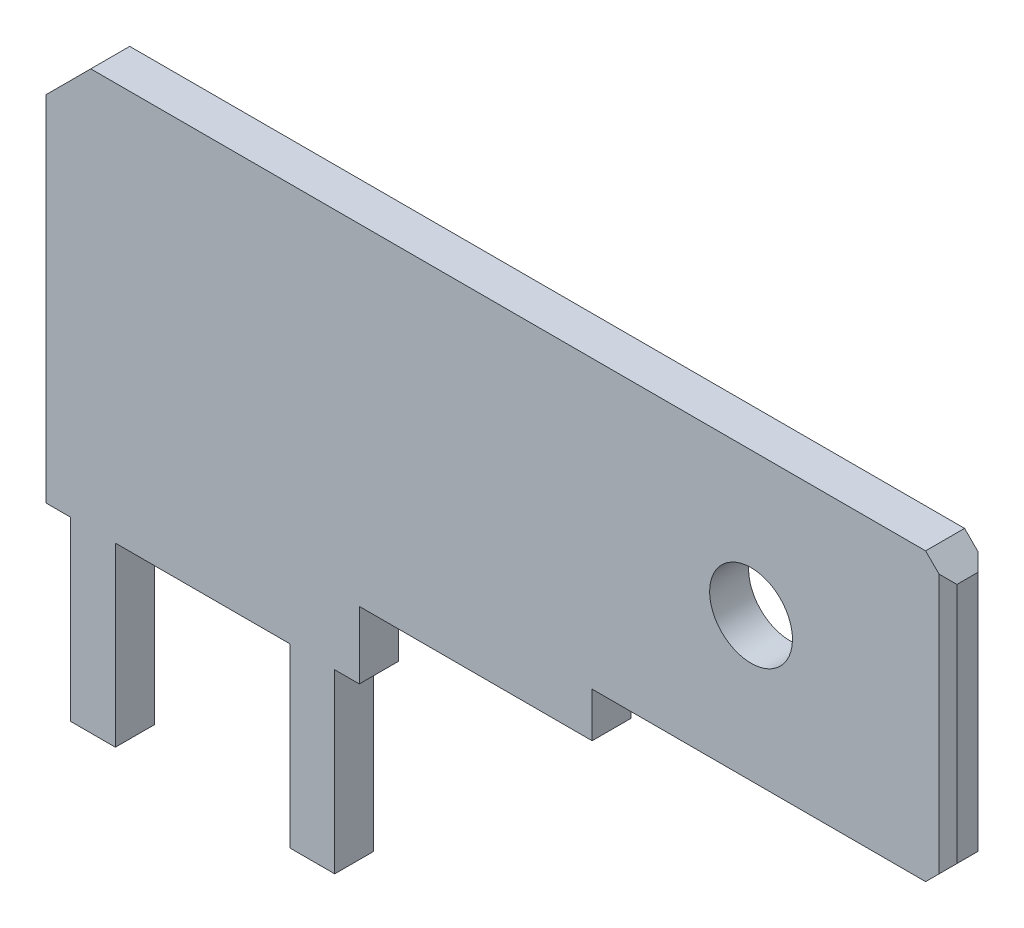
ISO-10303-21;
HEADER;
FILE_DESCRIPTION(('STEP AP214'),'2;1');
FILE_NAME('part.step','',(''),(''),'','','');
FILE_SCHEMA(('AUTOMOTIVE_DESIGN { 1 0 10303 214 1 1 1 1 }'));
ENDSEC;
DATA;
#1=APPLICATION_CONTEXT('core data for automotive mechanical design processes');
#2=APPLICATION_PROTOCOL_DEFINITION('international standard','automotive_design',2000,#1);
#3=PRODUCT_CONTEXT('',#1,'mechanical');
#4=PRODUCT('Part','Part','',(#3));
#5=PRODUCT_RELATED_PRODUCT_CATEGORY('part','',(#4));
#6=PRODUCT_DEFINITION_FORMATION('','',#4);
#7=PRODUCT_DEFINITION_CONTEXT('part definition',#1,'design');
#8=PRODUCT_DEFINITION('design','',#6,#7);
#9=PRODUCT_DEFINITION_SHAPE('','',#8);
#10=(LENGTH_UNIT() NAMED_UNIT(*) SI_UNIT(.MILLI.,.METRE.));
#11=(NAMED_UNIT(*) PLANE_ANGLE_UNIT() SI_UNIT($,.RADIAN.));
#12=(NAMED_UNIT(*) SI_UNIT($,.STERADIAN.) SOLID_ANGLE_UNIT());
#13=UNCERTAINTY_MEASURE_WITH_UNIT(LENGTH_MEASURE(1.E-05),#10,'distance_accuracy_value','');
#14=(GEOMETRIC_REPRESENTATION_CONTEXT(3) GLOBAL_UNCERTAINTY_ASSIGNED_CONTEXT((#13)) GLOBAL_UNIT_ASSIGNED_CONTEXT((#10,
#11,#12)) REPRESENTATION_CONTEXT('',''));
#15=CARTESIAN_POINT('',(0.,0.,0.));
#16=DIRECTION('',(0.,0.,1.));
#17=DIRECTION('',(1.,0.,0.));
#18=AXIS2_PLACEMENT_3D('',#15,#16,#17);
#19=CARTESIAN_POINT('',(20.05,-2.77804465493911,0.1));
#20=DIRECTION('',(0.707106781186547,0.,-0.707106781186548));
#21=DIRECTION('',(-0.707106781186548,0.,-0.707106781186547));
#22=AXIS2_PLACEMENT_3D('',#19,#20,#21);
#23=PLANE('',#22);
#24=DIRECTION('',(-0.577350269189627,-0.577350269189627,-0.577350269189623));
#25=VECTOR('',#24,1.);
#26=CARTESIAN_POINT('',(20.15,-5.9,0.200000000000002));
#27=LINE('',#26,#25);
#28=CARTESIAN_POINT('',(20.15,-5.9,0.200000000000001));
#29=VERTEX_POINT('',#28);
#30=CARTESIAN_POINT('',(19.95,-6.1,0.));
#31=VERTEX_POINT('',#30);
#32=EDGE_CURVE('E169',#29,#31,#27,.T.);
#33=ORIENTED_EDGE('',*,*,#32,.T.);
#34=DIRECTION('',(0.,1.,0.));
#35=VECTOR('',#34,1.);
#36=CARTESIAN_POINT('',(19.95,-5.55608930987822,0.));
#37=LINE('',#36,#35);
#38=CARTESIAN_POINT('',(19.95,-0.3,0.));
#39=VERTEX_POINT('',#38);
#40=EDGE_CURVE('E167',#31,#39,#37,.T.);
#41=ORIENTED_EDGE('',*,*,#40,.T.);
#42=DIRECTION('',(0.577350269189629,-0.577350269189625,0.577350269189624));
#43=VECTOR('',#42,1.);
#44=CARTESIAN_POINT('',(19.95,-0.299999999999999,0.));
#45=LINE('',#44,#43);
#46=CARTESIAN_POINT('',(20.15,-0.5,0.200000000000001));
#47=VERTEX_POINT('',#46);
#48=EDGE_CURVE('E161',#39,#47,#45,.T.);
#49=ORIENTED_EDGE('',*,*,#48,.T.);
#50=DIRECTION('',(0.,1.,0.));
#51=VECTOR('',#50,1.);
#52=CARTESIAN_POINT('',(20.15,0.,0.2));
#53=LINE('',#52,#51);
#54=EDGE_CURVE('E164',#29,#47,#53,.T.);
#55=ORIENTED_EDGE('',*,*,#54,.F.);
#56=EDGE_LOOP('',(#33,#41,#49,#55));
#57=FACE_BOUND('',#56,.T.);
#58=ADVANCED_FACE('F16',(#57),#23,.T.);
#59=CARTESIAN_POINT('',(20.15,0.,0.));
#60=DIRECTION('',(1.,0.,0.));
#61=DIRECTION('',(0.,0.,-1.));
#62=AXIS2_PLACEMENT_3D('',#59,#60,#61);
#63=PLANE('',#62);
#64=DIRECTION('',(0.,1.,0.));
#65=VECTOR('',#64,1.);
#66=CARTESIAN_POINT('',(20.15,-2.77804465493911,0.669999999999998));
#67=LINE('',#66,#65);
#68=CARTESIAN_POINT('',(20.15,-5.9,0.67));
#69=VERTEX_POINT('',#68);
#70=CARTESIAN_POINT('',(20.15,-0.5,0.67));
#71=VERTEX_POINT('',#70);
#72=EDGE_CURVE('E266',#69,#71,#67,.T.);
#73=ORIENTED_EDGE('',*,*,#72,.F.);
#74=DIRECTION('',(0.,0.,1.));
#75=VECTOR('',#74,1.);
#76=CARTESIAN_POINT('',(20.15,-5.9,0.));
#77=LINE('',#76,#75);
#78=EDGE_CURVE('E180',#29,#69,#77,.T.);
#79=ORIENTED_EDGE('',*,*,#78,.F.);
#80=ORIENTED_EDGE('',*,*,#54,.T.);
#81=DIRECTION('',(0.,0.,-1.));
#82=VECTOR('',#81,1.);
#83=CARTESIAN_POINT('',(20.15,-0.5,0.));
#84=LINE('',#83,#82);
#85=EDGE_CURVE('E172',#47,#71,#84,.F.);
#86=ORIENTED_EDGE('',*,*,#85,.T.);
#87=EDGE_LOOP('',(#73,#79,#80,#86));
#88=FACE_BOUND('',#87,.T.);
#89=ADVANCED_FACE('F179',(#88),#63,.T.);
#90=CARTESIAN_POINT('',(8.29475642760488,-5.55608930987822,0.));
#91=DIRECTION('',(0.,0.,1.));
#92=DIRECTION('',(1.,0.,0.));
#93=AXIS2_PLACEMENT_3D('',#90,#91,#92);
#94=PLANE('',#93);
#95=CARTESIAN_POINT('',(15.75,-3.2,0.));
#96=DIRECTION('',(0.,0.,-1.));
#97=DIRECTION('',(0.,1.,0.));
#98=AXIS2_PLACEMENT_3D('',#95,#96,#97);
#99=CIRCLE('',#98,0.925000000000001);
#100=CARTESIAN_POINT('',(15.75,-2.275,0.));
#101=VERTEX_POINT('',#100);
#102=EDGE_CURVE('E20',#101,#101,#99,.F.);
#103=ORIENTED_EDGE('',*,*,#102,.T.);
#104=EDGE_LOOP('',(#103));
#105=FACE_BOUND('',#104,.T.);
#106=DIRECTION('',(1.,0.,0.));
#107=VECTOR('',#106,1.);
#108=CARTESIAN_POINT('',(0.,0.,0.));
#109=LINE('',#108,#107);
#110=CARTESIAN_POINT('',(19.65,0.,0.));
#111=VERTEX_POINT('',#110);
#112=CARTESIAN_POINT('',(1.,0.,0.));
#113=VERTEX_POINT('',#112);
#114=EDGE_CURVE('E275',#111,#113,#109,.F.);
#115=ORIENTED_EDGE('',*,*,#114,.F.);
#116=DIRECTION('',(-0.707106781186548,0.707106781186547,0.));
#117=VECTOR('',#116,1.);
#118=CARTESIAN_POINT('',(19.9,-0.25,0.));
#119=LINE('',#118,#117);
#120=EDGE_CURVE('E268',#39,#111,#119,.T.);
#121=ORIENTED_EDGE('',*,*,#120,.F.);
#122=ORIENTED_EDGE('',*,*,#40,.F.);
#123=DIRECTION('',(0.707106781186548,0.707106781186548,0.));
#124=VECTOR('',#123,1.);
#125=CARTESIAN_POINT('',(19.9,-6.15,0.));
#126=LINE('',#125,#124);
#127=CARTESIAN_POINT('',(19.65,-6.4,0.));
#128=VERTEX_POINT('',#127);
#129=EDGE_CURVE('E260',#128,#31,#126,.T.);
#130=ORIENTED_EDGE('',*,*,#129,.F.);
#131=DIRECTION('',(1.,0.,0.));
#132=VECTOR('',#131,1.);
#133=CARTESIAN_POINT('',(20.15,-6.4,0.));
#134=LINE('',#133,#132);
#135=CARTESIAN_POINT('',(12.2,-6.4,0.));
#136=VERTEX_POINT('',#135);
#137=EDGE_CURVE('E254',#136,#128,#134,.T.);
#138=ORIENTED_EDGE('',*,*,#137,.F.);
#139=DIRECTION('',(0.,1.,0.));
#140=VECTOR('',#139,1.);
#141=CARTESIAN_POINT('',(12.2,-6.4,0.));
#142=LINE('',#141,#140);
#143=CARTESIAN_POINT('',(12.2,-7.4,0.));
#144=VERTEX_POINT('',#143);
#145=EDGE_CURVE('E249',#144,#136,#142,.T.);
#146=ORIENTED_EDGE('',*,*,#145,.F.);
#147=DIRECTION('',(1.,0.,0.));
#148=VECTOR('',#147,1.);
#149=CARTESIAN_POINT('',(12.2,-7.4,0.));
#150=LINE('',#149,#148);
#151=CARTESIAN_POINT('',(7.,-7.4,0.));
#152=VERTEX_POINT('',#151);
#153=EDGE_CURVE('E244',#152,#144,#150,.T.);
#154=ORIENTED_EDGE('',*,*,#153,.F.);
#155=DIRECTION('',(0.,1.,0.));
#156=VECTOR('',#155,1.);
#157=CARTESIAN_POINT('',(7.,-7.4,0.));
#158=LINE('',#157,#156);
#159=CARTESIAN_POINT('',(7.,-8.9,0.));
#160=VERTEX_POINT('',#159);
#161=EDGE_CURVE('E239',#160,#152,#158,.T.);
#162=ORIENTED_EDGE('',*,*,#161,.F.);
#163=DIRECTION('',(1.,0.,0.));
#164=VECTOR('',#163,1.);
#165=CARTESIAN_POINT('',(7.,-8.9,0.));
#166=LINE('',#165,#164);
#167=CARTESIAN_POINT('',(6.45,-8.9,0.));
#168=VERTEX_POINT('',#167);
#169=EDGE_CURVE('E234',#168,#160,#166,.T.);
#170=ORIENTED_EDGE('',*,*,#169,.F.);
#171=DIRECTION('',(0.,1.,0.));
#172=VECTOR('',#171,1.);
#173=CARTESIAN_POINT('',(6.45,-8.9,0.));
#174=LINE('',#173,#172);
#175=CARTESIAN_POINT('',(6.45,-12.85,0.));
#176=VERTEX_POINT('',#175);
#177=EDGE_CURVE('E229',#176,#168,#174,.T.);
#178=ORIENTED_EDGE('',*,*,#177,.F.);
#179=DIRECTION('',(1.,0.,0.));
#180=VECTOR('',#179,1.);
#181=CARTESIAN_POINT('',(6.45,-12.85,0.));
#182=LINE('',#181,#180);
#183=CARTESIAN_POINT('',(5.45,-12.85,0.));
#184=VERTEX_POINT('',#183);
#185=EDGE_CURVE('E224',#184,#176,#182,.T.);
#186=ORIENTED_EDGE('',*,*,#185,.F.);
#187=DIRECTION('',(0.,1.,0.));
#188=VECTOR('',#187,1.);
#189=CARTESIAN_POINT('',(5.45,-12.85,0.));
#190=LINE('',#189,#188);
#191=CARTESIAN_POINT('',(5.45,-8.9,0.));
#192=VERTEX_POINT('',#191);
#193=EDGE_CURVE('E219',#192,#184,#190,.F.);
#194=ORIENTED_EDGE('',*,*,#193,.F.);
#195=DIRECTION('',(1.,0.,0.));
#196=VECTOR('',#195,1.);
#197=CARTESIAN_POINT('',(5.45,-8.9,0.));
#198=LINE('',#197,#196);
#199=CARTESIAN_POINT('',(1.55,-8.9,0.));
#200=VERTEX_POINT('',#199);
#201=EDGE_CURVE('E214',#200,#192,#198,.T.);
#202=ORIENTED_EDGE('',*,*,#201,.F.);
#203=DIRECTION('',(0.,1.,0.));
#204=VECTOR('',#203,1.);
#205=CARTESIAN_POINT('',(1.55,-8.9,0.));
#206=LINE('',#205,#204);
#207=CARTESIAN_POINT('',(1.55,-12.85,0.));
#208=VERTEX_POINT('',#207);
#209=EDGE_CURVE('E209',#208,#200,#206,.T.);
#210=ORIENTED_EDGE('',*,*,#209,.F.);
#211=DIRECTION('',(1.,0.,0.));
#212=VECTOR('',#211,1.);
#213=CARTESIAN_POINT('',(1.55,-12.85,0.));
#214=LINE('',#213,#212);
#215=CARTESIAN_POINT('',(0.55,-12.85,0.));
#216=VERTEX_POINT('',#215);
#217=EDGE_CURVE('E204',#216,#208,#214,.T.);
#218=ORIENTED_EDGE('',*,*,#217,.F.);
#219=DIRECTION('',(0.,1.,0.));
#220=VECTOR('',#219,1.);
#221=CARTESIAN_POINT('',(0.55,-12.85,0.));
#222=LINE('',#221,#220);
#223=CARTESIAN_POINT('',(0.55,-8.9,0.));
#224=VERTEX_POINT('',#223);
#225=EDGE_CURVE('E199',#224,#216,#222,.F.);
#226=ORIENTED_EDGE('',*,*,#225,.F.);
#227=DIRECTION('',(1.,0.,0.));
#228=VECTOR('',#227,1.);
#229=CARTESIAN_POINT('',(0.55,-8.9,0.));
#230=LINE('',#229,#228);
#231=CARTESIAN_POINT('',(0.,-8.9,0.));
#232=VERTEX_POINT('',#231);
#233=EDGE_CURVE('E194',#232,#224,#230,.T.);
#234=ORIENTED_EDGE('',*,*,#233,.F.);
#235=DIRECTION('',(0.,1.,0.));
#236=VECTOR('',#235,1.);
#237=CARTESIAN_POINT('',(0.,-8.9,0.));
#238=LINE('',#237,#236);
#239=CARTESIAN_POINT('',(0.,-1.,0.));
#240=VERTEX_POINT('',#239);
#241=EDGE_CURVE('E189',#240,#232,#238,.F.);
#242=ORIENTED_EDGE('',*,*,#241,.F.);
#243=DIRECTION('',(-0.707106781186548,-0.707106781186547,0.));
#244=VECTOR('',#243,1.);
#245=CARTESIAN_POINT('',(0.5,-0.5,0.));
#246=LINE('',#245,#244);
#247=EDGE_CURVE('E155',#113,#240,#246,.T.);
#248=ORIENTED_EDGE('',*,*,#247,.F.);
#249=EDGE_LOOP('',(#115,#121,#122,#130,#138,#146,#154,#162,#170,#178,#186,#194,#202,#210,#218,
#226,#234,#242,#248));
#250=FACE_BOUND('',#249,.T.);
#251=ADVANCED_FACE('F533',(#105,#250),#94,.F.);
#252=CARTESIAN_POINT('',(0.5,-0.5,0.));
#253=DIRECTION('',(-0.707106781186547,0.707106781186548,0.));
#254=DIRECTION('',(-0.707106781186548,-0.707106781186547,0.));
#255=AXIS2_PLACEMENT_3D('',#252,#253,#254);
#256=PLANE('',#255);
#257=ORIENTED_EDGE('',*,*,#247,.T.);
#258=DIRECTION('',(0.,0.,1.));
#259=VECTOR('',#258,1.);
#260=CARTESIAN_POINT('',(0.,-1.,0.));
#261=LINE('',#260,#259);
#262=CARTESIAN_POINT('',(0.,-1.,0.87));
#263=VERTEX_POINT('',#262);
#264=EDGE_CURVE('E186',#263,#240,#261,.F.);
#265=ORIENTED_EDGE('',*,*,#264,.F.);
#266=DIRECTION('',(-0.707106781186548,-0.707106781186547,0.));
#267=VECTOR('',#266,1.);
#268=CARTESIAN_POINT('',(1.,0.,0.87));
#269=LINE('',#268,#267);
#270=CARTESIAN_POINT('',(1.,0.,0.87));
#271=VERTEX_POINT('',#270);
#272=EDGE_CURVE('E278',#271,#263,#269,.T.);
#273=ORIENTED_EDGE('',*,*,#272,.F.);
#274=DIRECTION('',(0.,0.,1.));
#275=VECTOR('',#274,1.);
#276=CARTESIAN_POINT('',(1.,0.,0.));
#277=LINE('',#276,#275);
#278=EDGE_CURVE('E271',#113,#271,#277,.T.);
#279=ORIENTED_EDGE('',*,*,#278,.F.);
#280=EDGE_LOOP('',(#257,#265,#273,#279));
#281=FACE_BOUND('',#280,.T.);
#282=ADVANCED_FACE('F338',(#281),#256,.T.);
#283=CARTESIAN_POINT('',(0.,-8.9,0.));
#284=DIRECTION('',(-1.,0.,0.));
#285=DIRECTION('',(0.,0.,1.));
#286=AXIS2_PLACEMENT_3D('',#283,#284,#285);
#287=PLANE('',#286);
#288=DIRECTION('',(0.,0.,-1.));
#289=VECTOR('',#288,1.);
#290=CARTESIAN_POINT('',(0.,-8.9,0.));
#291=LINE('',#290,#289);
#292=CARTESIAN_POINT('',(0.,-8.9,0.87));
#293=VERTEX_POINT('',#292);
#294=EDGE_CURVE('E191',#293,#232,#291,.T.);
#295=ORIENTED_EDGE('',*,*,#294,.F.);
#296=DIRECTION('',(0.,1.,0.));
#297=VECTOR('',#296,1.);
#298=CARTESIAN_POINT('',(0.,-5.55608930987821,0.87));
#299=LINE('',#298,#297);
#300=EDGE_CURVE('E281',#263,#293,#299,.F.);
#301=ORIENTED_EDGE('',*,*,#300,.F.);
#302=ORIENTED_EDGE('',*,*,#264,.T.);
#303=ORIENTED_EDGE('',*,*,#241,.T.);
#304=EDGE_LOOP('',(#295,#301,#302,#303));
#305=FACE_BOUND('',#304,.T.);
#306=ADVANCED_FACE('F341',(#305),#287,.T.);
#307=CARTESIAN_POINT('',(0.55,-8.9,0.));
#308=DIRECTION('',(0.,-1.,0.));
#309=DIRECTION('',(0.,0.,-1.));
#310=AXIS2_PLACEMENT_3D('',#307,#308,#309);
#311=PLANE('',#310);
#312=ORIENTED_EDGE('',*,*,#233,.T.);
#313=DIRECTION('',(0.,0.,1.));
#314=VECTOR('',#313,1.);
#315=CARTESIAN_POINT('',(0.55,-8.9,0.));
#316=LINE('',#315,#314);
#317=CARTESIAN_POINT('',(0.55,-8.9,0.87));
#318=VERTEX_POINT('',#317);
#319=EDGE_CURVE('E196',#318,#224,#316,.F.);
#320=ORIENTED_EDGE('',*,*,#319,.F.);
#321=DIRECTION('',(1.,0.,0.));
#322=VECTOR('',#321,1.);
#323=CARTESIAN_POINT('',(8.29475642760487,-8.9,0.87));
#324=LINE('',#323,#322);
#325=EDGE_CURVE('E284',#293,#318,#324,.T.);
#326=ORIENTED_EDGE('',*,*,#325,.F.);
#327=ORIENTED_EDGE('',*,*,#294,.T.);
#328=EDGE_LOOP('',(#312,#320,#326,#327));
#329=FACE_BOUND('',#328,.T.);
#330=ADVANCED_FACE('F345',(#329),#311,.T.);
#331=CARTESIAN_POINT('',(0.55,-12.85,0.));
#332=DIRECTION('',(-1.,0.,0.));
#333=DIRECTION('',(0.,0.,1.));
#334=AXIS2_PLACEMENT_3D('',#331,#332,#333);
#335=PLANE('',#334);
#336=ORIENTED_EDGE('',*,*,#225,.T.);
#337=DIRECTION('',(0.,0.,-1.));
#338=VECTOR('',#337,1.);
#339=CARTESIAN_POINT('',(0.55,-12.85,0.));
#340=LINE('',#339,#338);
#341=CARTESIAN_POINT('',(0.55,-12.85,0.87));
#342=VERTEX_POINT('',#341);
#343=EDGE_CURVE('E201',#342,#216,#340,.T.);
#344=ORIENTED_EDGE('',*,*,#343,.F.);
#345=DIRECTION('',(0.,1.,0.));
#346=VECTOR('',#345,1.);
#347=CARTESIAN_POINT('',(0.55,-5.55608930987821,0.87));
#348=LINE('',#347,#346);
#349=EDGE_CURVE('E287',#318,#342,#348,.F.);
#350=ORIENTED_EDGE('',*,*,#349,.F.);
#351=ORIENTED_EDGE('',*,*,#319,.T.);
#352=EDGE_LOOP('',(#336,#344,#350,#351));
#353=FACE_BOUND('',#352,.T.);
#354=ADVANCED_FACE('F349',(#353),#335,.T.);
#355=CARTESIAN_POINT('',(1.55,-12.85,0.));
#356=DIRECTION('',(0.,-1.,0.));
#357=DIRECTION('',(0.,0.,-1.));
#358=AXIS2_PLACEMENT_3D('',#355,#356,#357);
#359=PLANE('',#358);
#360=ORIENTED_EDGE('',*,*,#217,.T.);
#361=DIRECTION('',(0.,0.,-1.));
#362=VECTOR('',#361,1.);
#363=CARTESIAN_POINT('',(1.55,-12.85,0.));
#364=LINE('',#363,#362);
#365=CARTESIAN_POINT('',(1.55,-12.85,0.87));
#366=VERTEX_POINT('',#365);
#367=EDGE_CURVE('E206',#366,#208,#364,.T.);
#368=ORIENTED_EDGE('',*,*,#367,.F.);
#369=DIRECTION('',(1.,0.,0.));
#370=VECTOR('',#369,1.);
#371=CARTESIAN_POINT('',(8.29475642760487,-12.85,0.87));
#372=LINE('',#371,#370);
#373=EDGE_CURVE('E290',#342,#366,#372,.T.);
#374=ORIENTED_EDGE('',*,*,#373,.F.);
#375=ORIENTED_EDGE('',*,*,#343,.T.);
#376=EDGE_LOOP('',(#360,#368,#374,#375));
#377=FACE_BOUND('',#376,.T.);
#378=ADVANCED_FACE('F353',(#377),#359,.T.);
#379=CARTESIAN_POINT('',(1.55,-8.9,0.));
#380=DIRECTION('',(1.,0.,0.));
#381=DIRECTION('',(0.,0.,-1.));
#382=AXIS2_PLACEMENT_3D('',#379,#380,#381);
#383=PLANE('',#382);
#384=ORIENTED_EDGE('',*,*,#209,.T.);
#385=DIRECTION('',(0.,0.,-1.));
#386=VECTOR('',#385,1.);
#387=CARTESIAN_POINT('',(1.55,-8.9,0.));
#388=LINE('',#387,#386);
#389=CARTESIAN_POINT('',(1.55,-8.9,0.87));
#390=VERTEX_POINT('',#389);
#391=EDGE_CURVE('E211',#390,#200,#388,.T.);
#392=ORIENTED_EDGE('',*,*,#391,.F.);
#393=DIRECTION('',(0.,1.,0.));
#394=VECTOR('',#393,1.);
#395=CARTESIAN_POINT('',(1.55,-5.55608930987821,0.87));
#396=LINE('',#395,#394);
#397=EDGE_CURVE('E293',#366,#390,#396,.T.);
#398=ORIENTED_EDGE('',*,*,#397,.F.);
#399=ORIENTED_EDGE('',*,*,#367,.T.);
#400=EDGE_LOOP('',(#384,#392,#398,#399));
#401=FACE_BOUND('',#400,.T.);
#402=ADVANCED_FACE('F357',(#401),#383,.T.);
#403=CARTESIAN_POINT('',(5.45,-8.9,0.));
#404=DIRECTION('',(0.,-1.,0.));
#405=DIRECTION('',(0.,0.,-1.));
#406=AXIS2_PLACEMENT_3D('',#403,#404,#405);
#407=PLANE('',#406);
#408=ORIENTED_EDGE('',*,*,#201,.T.);
#409=DIRECTION('',(0.,0.,1.));
#410=VECTOR('',#409,1.);
#411=CARTESIAN_POINT('',(5.45,-8.9,0.));
#412=LINE('',#411,#410);
#413=CARTESIAN_POINT('',(5.45,-8.9,0.87));
#414=VERTEX_POINT('',#413);
#415=EDGE_CURVE('E216',#414,#192,#412,.F.);
#416=ORIENTED_EDGE('',*,*,#415,.F.);
#417=DIRECTION('',(1.,0.,0.));
#418=VECTOR('',#417,1.);
#419=CARTESIAN_POINT('',(8.29475642760487,-8.9,0.87));
#420=LINE('',#419,#418);
#421=EDGE_CURVE('E296',#390,#414,#420,.T.);
#422=ORIENTED_EDGE('',*,*,#421,.F.);
#423=ORIENTED_EDGE('',*,*,#391,.T.);
#424=EDGE_LOOP('',(#408,#416,#422,#423));
#425=FACE_BOUND('',#424,.T.);
#426=ADVANCED_FACE('F361',(#425),#407,.T.);
#427=CARTESIAN_POINT('',(5.45,-12.85,0.));
#428=DIRECTION('',(-1.,0.,0.));
#429=DIRECTION('',(0.,0.,1.));
#430=AXIS2_PLACEMENT_3D('',#427,#428,#429);
#431=PLANE('',#430);
#432=ORIENTED_EDGE('',*,*,#193,.T.);
#433=DIRECTION('',(0.,0.,-1.));
#434=VECTOR('',#433,1.);
#435=CARTESIAN_POINT('',(5.45,-12.85,0.));
#436=LINE('',#435,#434);
#437=CARTESIAN_POINT('',(5.45,-12.85,0.87));
#438=VERTEX_POINT('',#437);
#439=EDGE_CURVE('E221',#438,#184,#436,.T.);
#440=ORIENTED_EDGE('',*,*,#439,.F.);
#441=DIRECTION('',(0.,1.,0.));
#442=VECTOR('',#441,1.);
#443=CARTESIAN_POINT('',(5.45,-5.55608930987821,0.87));
#444=LINE('',#443,#442);
#445=EDGE_CURVE('E299',#414,#438,#444,.F.);
#446=ORIENTED_EDGE('',*,*,#445,.F.);
#447=ORIENTED_EDGE('',*,*,#415,.T.);
#448=EDGE_LOOP('',(#432,#440,#446,#447));
#449=FACE_BOUND('',#448,.T.);
#450=ADVANCED_FACE('F365',(#449),#431,.T.);
#451=CARTESIAN_POINT('',(6.45,-12.85,0.));
#452=DIRECTION('',(0.,-1.,0.));
#453=DIRECTION('',(0.,0.,-1.));
#454=AXIS2_PLACEMENT_3D('',#451,#452,#453);
#455=PLANE('',#454);
#456=ORIENTED_EDGE('',*,*,#185,.T.);
#457=DIRECTION('',(0.,0.,-1.));
#458=VECTOR('',#457,1.);
#459=CARTESIAN_POINT('',(6.45,-12.85,0.));
#460=LINE('',#459,#458);
#461=CARTESIAN_POINT('',(6.45,-12.85,0.87));
#462=VERTEX_POINT('',#461);
#463=EDGE_CURVE('E226',#462,#176,#460,.T.);
#464=ORIENTED_EDGE('',*,*,#463,.F.);
#465=DIRECTION('',(1.,0.,0.));
#466=VECTOR('',#465,1.);
#467=CARTESIAN_POINT('',(8.29475642760487,-12.85,0.87));
#468=LINE('',#467,#466);
#469=EDGE_CURVE('E302',#438,#462,#468,.T.);
#470=ORIENTED_EDGE('',*,*,#469,.F.);
#471=ORIENTED_EDGE('',*,*,#439,.T.);
#472=EDGE_LOOP('',(#456,#464,#470,#471));
#473=FACE_BOUND('',#472,.T.);
#474=ADVANCED_FACE('F369',(#473),#455,.T.);
#475=CARTESIAN_POINT('',(6.45,-8.9,0.));
#476=DIRECTION('',(1.,0.,0.));
#477=DIRECTION('',(0.,0.,-1.));
#478=AXIS2_PLACEMENT_3D('',#475,#476,#477);
#479=PLANE('',#478);
#480=ORIENTED_EDGE('',*,*,#177,.T.);
#481=DIRECTION('',(0.,0.,-1.));
#482=VECTOR('',#481,1.);
#483=CARTESIAN_POINT('',(6.45,-8.9,0.));
#484=LINE('',#483,#482);
#485=CARTESIAN_POINT('',(6.45,-8.9,0.87));
#486=VERTEX_POINT('',#485);
#487=EDGE_CURVE('E231',#486,#168,#484,.T.);
#488=ORIENTED_EDGE('',*,*,#487,.F.);
#489=DIRECTION('',(0.,1.,0.));
#490=VECTOR('',#489,1.);
#491=CARTESIAN_POINT('',(6.45,-5.55608930987821,0.87));
#492=LINE('',#491,#490);
#493=EDGE_CURVE('E305',#462,#486,#492,.T.);
#494=ORIENTED_EDGE('',*,*,#493,.F.);
#495=ORIENTED_EDGE('',*,*,#463,.T.);
#496=EDGE_LOOP('',(#480,#488,#494,#495));
#497=FACE_BOUND('',#496,.T.);
#498=ADVANCED_FACE('F373',(#497),#479,.T.);
#499=CARTESIAN_POINT('',(7.,-8.9,0.));
#500=DIRECTION('',(0.,-1.,0.));
#501=DIRECTION('',(0.,0.,-1.));
#502=AXIS2_PLACEMENT_3D('',#499,#500,#501);
#503=PLANE('',#502);
#504=ORIENTED_EDGE('',*,*,#169,.T.);
#505=DIRECTION('',(0.,0.,-1.));
#506=VECTOR('',#505,1.);
#507=CARTESIAN_POINT('',(7.,-8.9,0.));
#508=LINE('',#507,#506);
#509=CARTESIAN_POINT('',(7.,-8.9,0.87));
#510=VERTEX_POINT('',#509);
#511=EDGE_CURVE('E236',#510,#160,#508,.T.);
#512=ORIENTED_EDGE('',*,*,#511,.F.);
#513=DIRECTION('',(1.,0.,0.));
#514=VECTOR('',#513,1.);
#515=CARTESIAN_POINT('',(8.29475642760487,-8.9,0.87));
#516=LINE('',#515,#514);
#517=EDGE_CURVE('E308',#486,#510,#516,.T.);
#518=ORIENTED_EDGE('',*,*,#517,.F.);
#519=ORIENTED_EDGE('',*,*,#487,.T.);
#520=EDGE_LOOP('',(#504,#512,#518,#519));
#521=FACE_BOUND('',#520,.T.);
#522=ADVANCED_FACE('F377',(#521),#503,.T.);
#523=CARTESIAN_POINT('',(7.,-7.4,0.));
#524=DIRECTION('',(1.,0.,0.));
#525=DIRECTION('',(0.,0.,-1.));
#526=AXIS2_PLACEMENT_3D('',#523,#524,#525);
#527=PLANE('',#526);
#528=ORIENTED_EDGE('',*,*,#161,.T.);
#529=DIRECTION('',(0.,0.,-1.));
#530=VECTOR('',#529,1.);
#531=CARTESIAN_POINT('',(7.,-7.4,0.));
#532=LINE('',#531,#530);
#533=CARTESIAN_POINT('',(7.,-7.4,0.87));
#534=VERTEX_POINT('',#533);
#535=EDGE_CURVE('E241',#534,#152,#532,.T.);
#536=ORIENTED_EDGE('',*,*,#535,.F.);
#537=DIRECTION('',(0.,1.,0.));
#538=VECTOR('',#537,1.);
#539=CARTESIAN_POINT('',(7.,-5.55608930987821,0.87));
#540=LINE('',#539,#538);
#541=EDGE_CURVE('E311',#510,#534,#540,.T.);
#542=ORIENTED_EDGE('',*,*,#541,.F.);
#543=ORIENTED_EDGE('',*,*,#511,.T.);
#544=EDGE_LOOP('',(#528,#536,#542,#543));
#545=FACE_BOUND('',#544,.T.);
#546=ADVANCED_FACE('F381',(#545),#527,.T.);
#547=CARTESIAN_POINT('',(12.2,-7.4,0.));
#548=DIRECTION('',(0.,-1.,0.));
#549=DIRECTION('',(0.,0.,-1.));
#550=AXIS2_PLACEMENT_3D('',#547,#548,#549);
#551=PLANE('',#550);
#552=ORIENTED_EDGE('',*,*,#153,.T.);
#553=DIRECTION('',(0.,0.,-1.));
#554=VECTOR('',#553,1.);
#555=CARTESIAN_POINT('',(12.2,-7.4,0.));
#556=LINE('',#555,#554);
#557=CARTESIAN_POINT('',(12.2,-7.4,0.87));
#558=VERTEX_POINT('',#557);
#559=EDGE_CURVE('E246',#558,#144,#556,.T.);
#560=ORIENTED_EDGE('',*,*,#559,.F.);
#561=DIRECTION('',(1.,0.,0.));
#562=VECTOR('',#561,1.);
#563=CARTESIAN_POINT('',(8.29475642760487,-7.4,0.87));
#564=LINE('',#563,#562);
#565=EDGE_CURVE('E314',#534,#558,#564,.T.);
#566=ORIENTED_EDGE('',*,*,#565,.F.);
#567=ORIENTED_EDGE('',*,*,#535,.T.);
#568=EDGE_LOOP('',(#552,#560,#566,#567));
#569=FACE_BOUND('',#568,.T.);
#570=ADVANCED_FACE('F385',(#569),#551,.T.);
#571=CARTESIAN_POINT('',(12.2,-6.4,0.));
#572=DIRECTION('',(1.,0.,0.));
#573=DIRECTION('',(0.,0.,-1.));
#574=AXIS2_PLACEMENT_3D('',#571,#572,#573);
#575=PLANE('',#574);
#576=ORIENTED_EDGE('',*,*,#145,.T.);
#577=DIRECTION('',(0.,0.,-1.));
#578=VECTOR('',#577,1.);
#579=CARTESIAN_POINT('',(12.2,-6.4,0.));
#580=LINE('',#579,#578);
#581=CARTESIAN_POINT('',(12.2,-6.4,0.87));
#582=VERTEX_POINT('',#581);
#583=EDGE_CURVE('E251',#582,#136,#580,.T.);
#584=ORIENTED_EDGE('',*,*,#583,.F.);
#585=DIRECTION('',(0.,1.,0.));
#586=VECTOR('',#585,1.);
#587=CARTESIAN_POINT('',(12.2,-5.55608930987821,0.87));
#588=LINE('',#587,#586);
#589=EDGE_CURVE('E317',#558,#582,#588,.T.);
#590=ORIENTED_EDGE('',*,*,#589,.F.);
#591=ORIENTED_EDGE('',*,*,#559,.T.);
#592=EDGE_LOOP('',(#576,#584,#590,#591));
#593=FACE_BOUND('',#592,.T.);
#594=ADVANCED_FACE('F389',(#593),#575,.T.);
#595=CARTESIAN_POINT('',(20.15,-6.4,0.));
#596=DIRECTION('',(0.,-1.,0.));
#597=DIRECTION('',(0.,0.,-1.));
#598=AXIS2_PLACEMENT_3D('',#595,#596,#597);
#599=PLANE('',#598);
#600=ORIENTED_EDGE('',*,*,#583,.T.);
#601=ORIENTED_EDGE('',*,*,#137,.T.);
#602=DIRECTION('',(0.,0.,1.));
#603=VECTOR('',#602,1.);
#604=CARTESIAN_POINT('',(19.65,-6.4,0.));
#605=LINE('',#604,#603);
#606=CARTESIAN_POINT('',(19.65,-6.4,0.87));
#607=VERTEX_POINT('',#606);
#608=EDGE_CURVE('E257',#607,#128,#605,.F.);
#609=ORIENTED_EDGE('',*,*,#608,.F.);
#610=DIRECTION('',(1.,0.,0.));
#611=VECTOR('',#610,1.);
#612=CARTESIAN_POINT('',(8.29475642760487,-6.4,0.87));
#613=LINE('',#612,#611);
#614=EDGE_CURVE('E320',#582,#607,#613,.T.);
#615=ORIENTED_EDGE('',*,*,#614,.F.);
#616=EDGE_LOOP('',(#600,#601,#609,#615));
#617=FACE_BOUND('',#616,.T.);
#618=ADVANCED_FACE('F393',(#617),#599,.T.);
#619=CARTESIAN_POINT('',(19.9,-6.15,0.));
#620=DIRECTION('',(0.707106781186548,-0.707106781186548,0.));
#621=DIRECTION('',(0.707106781186548,0.707106781186548,0.));
#622=AXIS2_PLACEMENT_3D('',#619,#620,#621);
#623=PLANE('',#622);
#624=ORIENTED_EDGE('',*,*,#608,.T.);
#625=ORIENTED_EDGE('',*,*,#129,.T.);
#626=ORIENTED_EDGE('',*,*,#32,.F.);
#627=ORIENTED_EDGE('',*,*,#78,.T.);
#628=DIRECTION('',(0.577350269189628,0.577350269189626,-0.577350269189623));
#629=VECTOR('',#628,1.);
#630=CARTESIAN_POINT('',(19.95,-6.1,0.869999999999999));
#631=LINE('',#630,#629);
#632=CARTESIAN_POINT('',(19.95,-6.1,0.87));
#633=VERTEX_POINT('',#632);
#634=EDGE_CURVE('E263',#633,#69,#631,.T.);
#635=ORIENTED_EDGE('',*,*,#634,.F.);
#636=DIRECTION('',(0.707106781186547,0.707106781186549,0.));
#637=VECTOR('',#636,1.);
#638=CARTESIAN_POINT('',(19.65,-6.4,0.87));
#639=LINE('',#638,#637);
#640=EDGE_CURVE('E323',#607,#633,#639,.T.);
#641=ORIENTED_EDGE('',*,*,#640,.F.);
#642=EDGE_LOOP('',(#624,#625,#626,#627,#635,#641));
#643=FACE_BOUND('',#642,.T.);
#644=ADVANCED_FACE('F397',(#643),#623,.T.);
#645=CARTESIAN_POINT('',(20.05,-2.77804465493911,0.77));
#646=DIRECTION('',(0.707106781186547,0.,0.707106781186548));
#647=DIRECTION('',(0.707106781186548,0.,-0.707106781186547));
#648=AXIS2_PLACEMENT_3D('',#645,#646,#647);
#649=PLANE('',#648);
#650=DIRECTION('',(0.577350269189629,-0.577350269189626,-0.577350269189622));
#651=VECTOR('',#650,1.);
#652=CARTESIAN_POINT('',(19.95,-0.299999999999998,0.87));
#653=LINE('',#652,#651);
#654=CARTESIAN_POINT('',(19.95,-0.299999999999997,0.869999999999999));
#655=VERTEX_POINT('',#654);
#656=EDGE_CURVE('E174',#655,#71,#653,.T.);
#657=ORIENTED_EDGE('',*,*,#656,.F.);
#658=DIRECTION('',(0.,1.,0.));
#659=VECTOR('',#658,1.);
#660=CARTESIAN_POINT('',(19.95,-5.55608930987821,0.87));
#661=LINE('',#660,#659);
#662=EDGE_CURVE('E326',#633,#655,#661,.T.);
#663=ORIENTED_EDGE('',*,*,#662,.F.);
#664=ORIENTED_EDGE('',*,*,#634,.T.);
#665=ORIENTED_EDGE('',*,*,#72,.T.);
#666=EDGE_LOOP('',(#657,#663,#664,#665));
#667=FACE_BOUND('',#666,.T.);
#668=ADVANCED_FACE('F400',(#667),#649,.T.);
#669=CARTESIAN_POINT('',(19.9,-0.25,0.));
#670=DIRECTION('',(0.707106781186547,0.707106781186548,0.));
#671=DIRECTION('',(-0.707106781186548,0.707106781186547,0.));
#672=AXIS2_PLACEMENT_3D('',#669,#670,#671);
#673=PLANE('',#672);
#674=ORIENTED_EDGE('',*,*,#656,.T.);
#675=ORIENTED_EDGE('',*,*,#85,.F.);
#676=ORIENTED_EDGE('',*,*,#48,.F.);
#677=ORIENTED_EDGE('',*,*,#120,.T.);
#678=DIRECTION('',(0.,0.,1.));
#679=VECTOR('',#678,1.);
#680=CARTESIAN_POINT('',(19.65,0.,0.));
#681=LINE('',#680,#679);
#682=CARTESIAN_POINT('',(19.65,0.,0.87));
#683=VERTEX_POINT('',#682);
#684=EDGE_CURVE('E34',#683,#111,#681,.F.);
#685=ORIENTED_EDGE('',*,*,#684,.F.);
#686=DIRECTION('',(-0.707106781186548,0.707106781186546,0.));
#687=VECTOR('',#686,1.);
#688=CARTESIAN_POINT('',(19.95,-0.299999999999997,0.87));
#689=LINE('',#688,#687);
#690=EDGE_CURVE('E329',#655,#683,#689,.T.);
#691=ORIENTED_EDGE('',*,*,#690,.F.);
#692=EDGE_LOOP('',(#674,#675,#676,#677,#685,#691));
#693=FACE_BOUND('',#692,.T.);
#694=ADVANCED_FACE('F173',(#693),#673,.T.);
#695=CARTESIAN_POINT('',(0.,0.,0.));
#696=DIRECTION('',(0.,1.,0.));
#697=DIRECTION('',(0.,0.,1.));
#698=AXIS2_PLACEMENT_3D('',#695,#696,#697);
#699=PLANE('',#698);
#700=ORIENTED_EDGE('',*,*,#684,.T.);
#701=ORIENTED_EDGE('',*,*,#114,.T.);
#702=ORIENTED_EDGE('',*,*,#278,.T.);
#703=DIRECTION('',(1.,0.,0.));
#704=VECTOR('',#703,1.);
#705=CARTESIAN_POINT('',(8.29475642760487,0.,0.87));
#706=LINE('',#705,#704);
#707=EDGE_CURVE('E26',#683,#271,#706,.F.);
#708=ORIENTED_EDGE('',*,*,#707,.F.);
#709=EDGE_LOOP('',(#700,#701,#702,#708));
#710=FACE_BOUND('',#709,.T.);
#711=ADVANCED_FACE('F336',(#710),#699,.T.);
#712=CARTESIAN_POINT('',(15.75,-3.2,0.870000000000001));
#713=DIRECTION('',(0.,0.,-1.));
#714=DIRECTION('',(0.,1.,0.));
#715=AXIS2_PLACEMENT_3D('',#712,#713,#714);
#716=CYLINDRICAL_SURFACE('',#715,0.925000000000001);
#717=CARTESIAN_POINT('',(15.75,-3.2,0.87));
#718=DIRECTION('',(0.,0.,-1.));
#719=DIRECTION('',(0.,1.,0.));
#720=AXIS2_PLACEMENT_3D('',#717,#718,#719);
#721=CIRCLE('',#720,0.925000000000001);
#722=CARTESIAN_POINT('',(15.75,-2.275,0.87));
#723=VERTEX_POINT('',#722);
#724=EDGE_CURVE('E11',#723,#723,#721,.T.);
#725=ORIENTED_EDGE('',*,*,#724,.F.);
#726=EDGE_LOOP('',(#725));
#727=FACE_BOUND('',#726,.T.);
#728=ORIENTED_EDGE('',*,*,#102,.F.);
#729=EDGE_LOOP('',(#728));
#730=FACE_BOUND('',#729,.T.);
#731=ADVANCED_FACE('F18',(#727,#730),#716,.F.);
#732=CARTESIAN_POINT('',(8.29475642760487,-5.55608930987821,0.87));
#733=DIRECTION('',(0.,0.,1.));
#734=DIRECTION('',(1.,0.,0.));
#735=AXIS2_PLACEMENT_3D('',#732,#733,#734);
#736=PLANE('',#735);
#737=ORIENTED_EDGE('',*,*,#724,.T.);
#738=EDGE_LOOP('',(#737));
#739=FACE_BOUND('',#738,.T.);
#740=ORIENTED_EDGE('',*,*,#690,.T.);
#741=ORIENTED_EDGE('',*,*,#707,.T.);
#742=ORIENTED_EDGE('',*,*,#272,.T.);
#743=ORIENTED_EDGE('',*,*,#300,.T.);
#744=ORIENTED_EDGE('',*,*,#325,.T.);
#745=ORIENTED_EDGE('',*,*,#349,.T.);
#746=ORIENTED_EDGE('',*,*,#373,.T.);
#747=ORIENTED_EDGE('',*,*,#397,.T.);
#748=ORIENTED_EDGE('',*,*,#421,.T.);
#749=ORIENTED_EDGE('',*,*,#445,.T.);
#750=ORIENTED_EDGE('',*,*,#469,.T.);
#751=ORIENTED_EDGE('',*,*,#493,.T.);
#752=ORIENTED_EDGE('',*,*,#517,.T.);
#753=ORIENTED_EDGE('',*,*,#541,.T.);
#754=ORIENTED_EDGE('',*,*,#565,.T.);
#755=ORIENTED_EDGE('',*,*,#589,.T.);
#756=ORIENTED_EDGE('',*,*,#614,.T.);
#757=ORIENTED_EDGE('',*,*,#640,.T.);
#758=ORIENTED_EDGE('',*,*,#662,.T.);
#759=EDGE_LOOP('',(#740,#741,#742,#743,#744,#745,#746,#747,#748,#749,#750,#751,#752,#753,#754,
#755,#756,#757,#758));
#760=FACE_BOUND('',#759,.T.);
#761=ADVANCED_FACE('F334',(#739,#760),#736,.T.);
#762=CLOSED_SHELL('',(#58,#89,#251,#282,#306,#330,#354,#378,#402,#426,#450,#474,#498,#522,#546,
#570,#594,#618,#644,#668,#694,#711,#731,#761));
#763=MANIFOLD_SOLID_BREP('B1',#762);
#764=ADVANCED_BREP_SHAPE_REPRESENTATION('',(#18,#763),#14);
#765=SHAPE_DEFINITION_REPRESENTATION(#9,#764);
ENDSEC;
END-ISO-10303-21;
